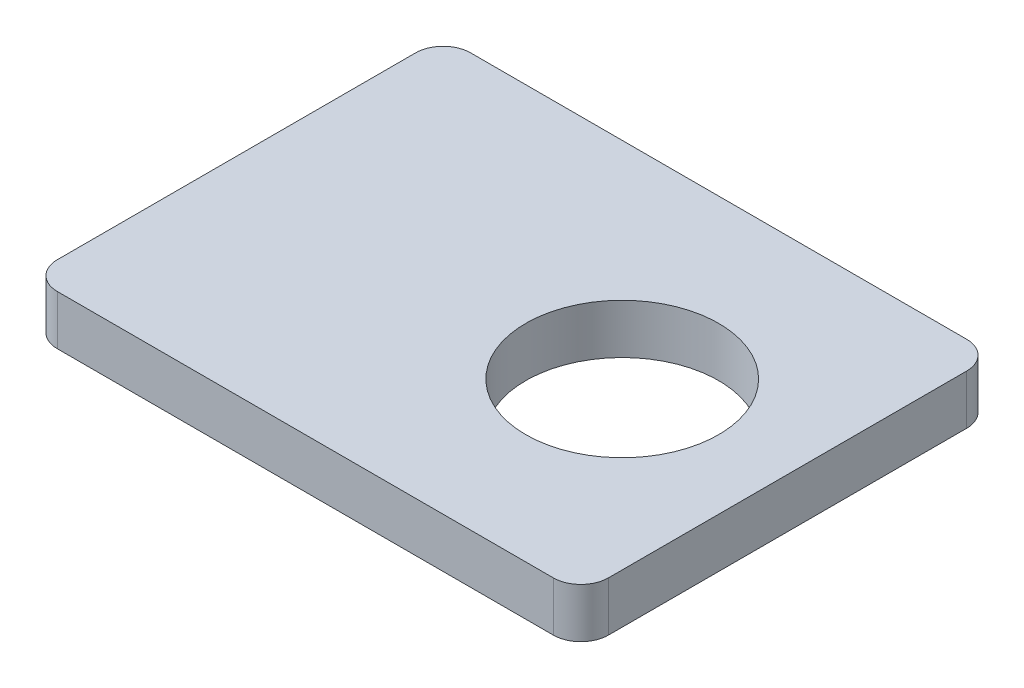
ISO-10303-21;
HEADER;
FILE_DESCRIPTION(('STEP AP214'),'2;1');
FILE_NAME('part.step','',(''),(''),'','','');
FILE_SCHEMA(('AUTOMOTIVE_DESIGN { 1 0 10303 214 1 1 1 1 }'));
ENDSEC;
DATA;
#1=APPLICATION_CONTEXT('core data for automotive mechanical design processes');
#2=APPLICATION_PROTOCOL_DEFINITION('international standard','automotive_design',2000,#1);
#3=PRODUCT_CONTEXT('',#1,'mechanical');
#4=PRODUCT('Part','Part','',(#3));
#5=PRODUCT_RELATED_PRODUCT_CATEGORY('part','',(#4));
#6=PRODUCT_DEFINITION_FORMATION('','',#4);
#7=PRODUCT_DEFINITION_CONTEXT('part definition',#1,'design');
#8=PRODUCT_DEFINITION('design','',#6,#7);
#9=PRODUCT_DEFINITION_SHAPE('','',#8);
#10=(LENGTH_UNIT() NAMED_UNIT(*) SI_UNIT(.MILLI.,.METRE.));
#11=(NAMED_UNIT(*) PLANE_ANGLE_UNIT() SI_UNIT($,.RADIAN.));
#12=(NAMED_UNIT(*) SI_UNIT($,.STERADIAN.) SOLID_ANGLE_UNIT());
#13=UNCERTAINTY_MEASURE_WITH_UNIT(LENGTH_MEASURE(1.E-05),#10,'distance_accuracy_value','');
#14=(GEOMETRIC_REPRESENTATION_CONTEXT(3) GLOBAL_UNCERTAINTY_ASSIGNED_CONTEXT((#13)) GLOBAL_UNIT_ASSIGNED_CONTEXT((#10,
#11,#12)) REPRESENTATION_CONTEXT('',''));
#15=CARTESIAN_POINT('',(0.,0.,0.));
#16=DIRECTION('',(0.,0.,1.));
#17=DIRECTION('',(1.,0.,0.));
#18=AXIS2_PLACEMENT_3D('',#15,#16,#17);
#19=CARTESIAN_POINT('',(0.,18.,0.));
#20=DIRECTION('',(0.,-1.,0.));
#21=DIRECTION('',(0.,0.,-1.));
#22=AXIS2_PLACEMENT_3D('',#19,#20,#21);
#23=PLANE('',#22);
#24=DIRECTION('',(-1.,0.,0.));
#25=VECTOR('',#24,1.);
#26=CARTESIAN_POINT('',(-100.,18.,-75.));
#27=LINE('',#26,#25);
#28=CARTESIAN_POINT('',(90.,18.,-75.));
#29=VERTEX_POINT('',#28);
#30=CARTESIAN_POINT('',(-90.,18.,-75.));
#31=VERTEX_POINT('',#30);
#32=EDGE_CURVE('E139',#29,#31,#27,.T.);
#33=ORIENTED_EDGE('',*,*,#32,.T.);
#34=CARTESIAN_POINT('',(-90.,18.,-65.));
#35=DIRECTION('',(0.,-1.,0.));
#36=DIRECTION('',(0.,0.,-1.));
#37=AXIS2_PLACEMENT_3D('',#34,#35,#36);
#38=CIRCLE('',#37,10.);
#39=CARTESIAN_POINT('',(-100.,18.,-65.));
#40=VERTEX_POINT('',#39);
#41=EDGE_CURVE('E158',#31,#40,#38,.F.);
#42=ORIENTED_EDGE('',*,*,#41,.T.);
#43=DIRECTION('',(0.,0.,1.));
#44=VECTOR('',#43,1.);
#45=CARTESIAN_POINT('',(-100.,18.,75.));
#46=LINE('',#45,#44);
#47=CARTESIAN_POINT('',(-100.,18.,65.));
#48=VERTEX_POINT('',#47);
#49=EDGE_CURVE('E122',#40,#48,#46,.T.);
#50=ORIENTED_EDGE('',*,*,#49,.T.);
#51=CARTESIAN_POINT('',(-90.,18.,65.));
#52=DIRECTION('',(0.,-1.,0.));
#53=DIRECTION('',(0.,0.,-1.));
#54=AXIS2_PLACEMENT_3D('',#51,#52,#53);
#55=CIRCLE('',#54,10.);
#56=CARTESIAN_POINT('',(-90.,18.,75.));
#57=VERTEX_POINT('',#56);
#58=EDGE_CURVE('E156',#48,#57,#55,.F.);
#59=ORIENTED_EDGE('',*,*,#58,.T.);
#60=DIRECTION('',(1.,0.,0.));
#61=VECTOR('',#60,1.);
#62=CARTESIAN_POINT('',(-100.,18.,75.));
#63=LINE('',#62,#61);
#64=CARTESIAN_POINT('',(90.,18.,75.));
#65=VERTEX_POINT('',#64);
#66=EDGE_CURVE('E178',#57,#65,#63,.T.);
#67=ORIENTED_EDGE('',*,*,#66,.T.);
#68=CARTESIAN_POINT('',(90.,18.,65.));
#69=DIRECTION('',(0.,-1.,0.));
#70=DIRECTION('',(0.,0.,-1.));
#71=AXIS2_PLACEMENT_3D('',#68,#69,#70);
#72=CIRCLE('',#71,10.);
#73=CARTESIAN_POINT('',(100.,18.,65.));
#74=VERTEX_POINT('',#73);
#75=EDGE_CURVE('E57',#65,#74,#72,.F.);
#76=ORIENTED_EDGE('',*,*,#75,.T.);
#77=DIRECTION('',(0.,0.,-1.));
#78=VECTOR('',#77,1.);
#79=CARTESIAN_POINT('',(100.,18.,75.));
#80=LINE('',#79,#78);
#81=CARTESIAN_POINT('',(100.,18.,-65.));
#82=VERTEX_POINT('',#81);
#83=EDGE_CURVE('E168',#74,#82,#80,.T.);
#84=ORIENTED_EDGE('',*,*,#83,.T.);
#85=CARTESIAN_POINT('',(90.,18.,-65.));
#86=DIRECTION('',(0.,-1.,0.));
#87=DIRECTION('',(0.,0.,-1.));
#88=AXIS2_PLACEMENT_3D('',#85,#86,#87);
#89=CIRCLE('',#88,10.);
#90=EDGE_CURVE('E154',#82,#29,#89,.F.);
#91=ORIENTED_EDGE('',*,*,#90,.T.);
#92=EDGE_LOOP('',(#33,#42,#50,#59,#67,#76,#84,#91));
#93=FACE_BOUND('',#92,.T.);
#94=CARTESIAN_POINT('',(40.,18.,0.));
#95=DIRECTION('',(0.,1.,0.));
#96=DIRECTION('',(0.,0.,1.));
#97=AXIS2_PLACEMENT_3D('',#94,#95,#96);
#98=CIRCLE('',#97,35.);
#99=CARTESIAN_POINT('',(40.,18.,35.));
#100=VERTEX_POINT('',#99);
#101=EDGE_CURVE('E130',#100,#100,#98,.T.);
#102=ORIENTED_EDGE('',*,*,#101,.F.);
#103=EDGE_LOOP('',(#102));
#104=FACE_BOUND('',#103,.T.);
#105=ADVANCED_FACE('F37',(#93,#104),#23,.F.);
#106=CARTESIAN_POINT('',(0.,0.,0.));
#107=DIRECTION('',(0.,-1.,0.));
#108=DIRECTION('',(0.,0.,-1.));
#109=AXIS2_PLACEMENT_3D('',#106,#107,#108);
#110=PLANE('',#109);
#111=DIRECTION('',(0.,0.,1.));
#112=VECTOR('',#111,1.);
#113=CARTESIAN_POINT('',(-100.,0.,75.));
#114=LINE('',#113,#112);
#115=CARTESIAN_POINT('',(-100.,0.,-65.));
#116=VERTEX_POINT('',#115);
#117=CARTESIAN_POINT('',(-100.,0.,65.));
#118=VERTEX_POINT('',#117);
#119=EDGE_CURVE('E119',#116,#118,#114,.T.);
#120=ORIENTED_EDGE('',*,*,#119,.F.);
#121=CARTESIAN_POINT('',(-90.,0.,-65.));
#122=DIRECTION('',(0.,-1.,0.));
#123=DIRECTION('',(0.,0.,-1.));
#124=AXIS2_PLACEMENT_3D('',#121,#122,#123);
#125=CIRCLE('',#124,10.);
#126=CARTESIAN_POINT('',(-90.,0.,-75.));
#127=VERTEX_POINT('',#126);
#128=EDGE_CURVE('E102',#116,#127,#125,.T.);
#129=ORIENTED_EDGE('',*,*,#128,.T.);
#130=DIRECTION('',(-1.,0.,0.));
#131=VECTOR('',#130,1.);
#132=CARTESIAN_POINT('',(-100.,0.,-75.));
#133=LINE('',#132,#131);
#134=CARTESIAN_POINT('',(90.,0.,-75.));
#135=VERTEX_POINT('',#134);
#136=EDGE_CURVE('E143',#135,#127,#133,.T.);
#137=ORIENTED_EDGE('',*,*,#136,.F.);
#138=CARTESIAN_POINT('',(90.,0.,-65.));
#139=DIRECTION('',(0.,-1.,0.));
#140=DIRECTION('',(0.,0.,-1.));
#141=AXIS2_PLACEMENT_3D('',#138,#139,#140);
#142=CIRCLE('',#141,10.);
#143=CARTESIAN_POINT('',(100.,0.,-65.));
#144=VERTEX_POINT('',#143);
#145=EDGE_CURVE('E147',#135,#144,#142,.T.);
#146=ORIENTED_EDGE('',*,*,#145,.T.);
#147=DIRECTION('',(0.,0.,-1.));
#148=VECTOR('',#147,1.);
#149=CARTESIAN_POINT('',(100.,0.,75.));
#150=LINE('',#149,#148);
#151=CARTESIAN_POINT('',(100.,0.,65.));
#152=VERTEX_POINT('',#151);
#153=EDGE_CURVE('E133',#152,#144,#150,.T.);
#154=ORIENTED_EDGE('',*,*,#153,.F.);
#155=CARTESIAN_POINT('',(90.,0.,65.));
#156=DIRECTION('',(0.,-1.,0.));
#157=DIRECTION('',(0.,0.,-1.));
#158=AXIS2_PLACEMENT_3D('',#155,#156,#157);
#159=CIRCLE('',#158,10.);
#160=CARTESIAN_POINT('',(90.,0.,75.));
#161=VERTEX_POINT('',#160);
#162=EDGE_CURVE('E123',#152,#161,#159,.T.);
#163=ORIENTED_EDGE('',*,*,#162,.T.);
#164=DIRECTION('',(1.,0.,0.));
#165=VECTOR('',#164,1.);
#166=CARTESIAN_POINT('',(-100.,0.,75.));
#167=LINE('',#166,#165);
#168=CARTESIAN_POINT('',(-90.,0.,75.));
#169=VERTEX_POINT('',#168);
#170=EDGE_CURVE('E129',#169,#161,#167,.T.);
#171=ORIENTED_EDGE('',*,*,#170,.F.);
#172=CARTESIAN_POINT('',(-90.,0.,65.));
#173=DIRECTION('',(0.,-1.,0.));
#174=DIRECTION('',(0.,0.,-1.));
#175=AXIS2_PLACEMENT_3D('',#172,#173,#174);
#176=CIRCLE('',#175,10.);
#177=EDGE_CURVE('E113',#169,#118,#176,.T.);
#178=ORIENTED_EDGE('',*,*,#177,.T.);
#179=EDGE_LOOP('',(#120,#129,#137,#146,#154,#163,#171,#178));
#180=FACE_BOUND('',#179,.T.);
#181=CARTESIAN_POINT('',(40.,0.,0.));
#182=DIRECTION('',(0.,1.,0.));
#183=DIRECTION('',(0.,0.,1.));
#184=AXIS2_PLACEMENT_3D('',#181,#182,#183);
#185=CIRCLE('',#184,35.);
#186=CARTESIAN_POINT('',(40.,0.,35.));
#187=VERTEX_POINT('',#186);
#188=EDGE_CURVE('E136',#187,#187,#185,.T.);
#189=ORIENTED_EDGE('',*,*,#188,.T.);
#190=EDGE_LOOP('',(#189));
#191=FACE_BOUND('',#190,.T.);
#192=ADVANCED_FACE('F126',(#180,#191),#110,.T.);
#193=CARTESIAN_POINT('',(-100.,18.,75.));
#194=DIRECTION('',(1.,0.,0.));
#195=DIRECTION('',(0.,0.,-1.));
#196=AXIS2_PLACEMENT_3D('',#193,#194,#195);
#197=PLANE('',#196);
#198=ORIENTED_EDGE('',*,*,#49,.F.);
#199=DIRECTION('',(0.,-1.,0.));
#200=VECTOR('',#199,1.);
#201=CARTESIAN_POINT('',(-100.,18.,-65.));
#202=LINE('',#201,#200);
#203=EDGE_CURVE('E106',#40,#116,#202,.T.);
#204=ORIENTED_EDGE('',*,*,#203,.T.);
#205=ORIENTED_EDGE('',*,*,#119,.T.);
#206=DIRECTION('',(0.,-1.,0.));
#207=VECTOR('',#206,1.);
#208=CARTESIAN_POINT('',(-100.,18.,65.));
#209=LINE('',#208,#207);
#210=EDGE_CURVE('E124',#118,#48,#209,.F.);
#211=ORIENTED_EDGE('',*,*,#210,.T.);
#212=EDGE_LOOP('',(#198,#204,#205,#211));
#213=FACE_BOUND('',#212,.T.);
#214=ADVANCED_FACE('F118',(#213),#197,.F.);
#215=CARTESIAN_POINT('',(-100.,18.,75.));
#216=DIRECTION('',(0.,0.,-1.));
#217=DIRECTION('',(-1.,0.,0.));
#218=AXIS2_PLACEMENT_3D('',#215,#216,#217);
#219=PLANE('',#218);
#220=ORIENTED_EDGE('',*,*,#66,.F.);
#221=DIRECTION('',(0.,-1.,0.));
#222=VECTOR('',#221,1.);
#223=CARTESIAN_POINT('',(-90.,18.,75.));
#224=LINE('',#223,#222);
#225=EDGE_CURVE('E162',#57,#169,#224,.T.);
#226=ORIENTED_EDGE('',*,*,#225,.T.);
#227=ORIENTED_EDGE('',*,*,#170,.T.);
#228=DIRECTION('',(0.,-1.,0.));
#229=VECTOR('',#228,1.);
#230=CARTESIAN_POINT('',(90.,18.,75.));
#231=LINE('',#230,#229);
#232=EDGE_CURVE('E160',#161,#65,#231,.F.);
#233=ORIENTED_EDGE('',*,*,#232,.T.);
#234=EDGE_LOOP('',(#220,#226,#227,#233));
#235=FACE_BOUND('',#234,.T.);
#236=ADVANCED_FACE('F206',(#235),#219,.F.);
#237=CARTESIAN_POINT('',(100.,18.,75.));
#238=DIRECTION('',(-1.,0.,0.));
#239=DIRECTION('',(0.,0.,1.));
#240=AXIS2_PLACEMENT_3D('',#237,#238,#239);
#241=PLANE('',#240);
#242=ORIENTED_EDGE('',*,*,#153,.T.);
#243=DIRECTION('',(0.,-1.,0.));
#244=VECTOR('',#243,1.);
#245=CARTESIAN_POINT('',(100.,18.,-65.));
#246=LINE('',#245,#244);
#247=EDGE_CURVE('E11',#144,#82,#246,.F.);
#248=ORIENTED_EDGE('',*,*,#247,.T.);
#249=ORIENTED_EDGE('',*,*,#83,.F.);
#250=DIRECTION('',(0.,-1.,0.));
#251=VECTOR('',#250,1.);
#252=CARTESIAN_POINT('',(100.,18.,65.));
#253=LINE('',#252,#251);
#254=EDGE_CURVE('E45',#74,#152,#253,.T.);
#255=ORIENTED_EDGE('',*,*,#254,.T.);
#256=EDGE_LOOP('',(#242,#248,#249,#255));
#257=FACE_BOUND('',#256,.T.);
#258=ADVANCED_FACE('F167',(#257),#241,.F.);
#259=CARTESIAN_POINT('',(-100.,18.,-75.));
#260=DIRECTION('',(0.,0.,1.));
#261=DIRECTION('',(1.,0.,0.));
#262=AXIS2_PLACEMENT_3D('',#259,#260,#261);
#263=PLANE('',#262);
#264=ORIENTED_EDGE('',*,*,#136,.T.);
#265=DIRECTION('',(0.,-1.,0.));
#266=VECTOR('',#265,1.);
#267=CARTESIAN_POINT('',(-90.,18.,-75.));
#268=LINE('',#267,#266);
#269=EDGE_CURVE('E107',#127,#31,#268,.F.);
#270=ORIENTED_EDGE('',*,*,#269,.T.);
#271=ORIENTED_EDGE('',*,*,#32,.F.);
#272=DIRECTION('',(0.,-1.,0.));
#273=VECTOR('',#272,1.);
#274=CARTESIAN_POINT('',(90.,18.,-75.));
#275=LINE('',#274,#273);
#276=EDGE_CURVE('E112',#29,#135,#275,.T.);
#277=ORIENTED_EDGE('',*,*,#276,.T.);
#278=EDGE_LOOP('',(#264,#270,#271,#277));
#279=FACE_BOUND('',#278,.T.);
#280=ADVANCED_FACE('F176',(#279),#263,.F.);
#281=CARTESIAN_POINT('',(40.,18.,0.));
#282=DIRECTION('',(0.,-1.,0.));
#283=DIRECTION('',(0.,0.,-1.));
#284=AXIS2_PLACEMENT_3D('',#281,#282,#283);
#285=CYLINDRICAL_SURFACE('',#284,35.);
#286=ORIENTED_EDGE('',*,*,#101,.T.);
#287=EDGE_LOOP('',(#286));
#288=FACE_BOUND('',#287,.T.);
#289=ORIENTED_EDGE('',*,*,#188,.F.);
#290=EDGE_LOOP('',(#289));
#291=FACE_BOUND('',#290,.T.);
#292=ADVANCED_FACE('F185',(#288,#291),#285,.F.);
#293=CARTESIAN_POINT('',(-90.,18.,-65.));
#294=DIRECTION('',(0.,-1.,0.));
#295=DIRECTION('',(0.,0.,-1.));
#296=AXIS2_PLACEMENT_3D('',#293,#294,#295);
#297=CYLINDRICAL_SURFACE('',#296,10.);
#298=ORIENTED_EDGE('',*,*,#41,.F.);
#299=ORIENTED_EDGE('',*,*,#269,.F.);
#300=ORIENTED_EDGE('',*,*,#128,.F.);
#301=ORIENTED_EDGE('',*,*,#203,.F.);
#302=EDGE_LOOP('',(#298,#299,#300,#301));
#303=FACE_BOUND('',#302,.T.);
#304=ADVANCED_FACE('F105',(#303),#297,.T.);
#305=CARTESIAN_POINT('',(-90.,18.,65.));
#306=DIRECTION('',(0.,-1.,0.));
#307=DIRECTION('',(0.,0.,-1.));
#308=AXIS2_PLACEMENT_3D('',#305,#306,#307);
#309=CYLINDRICAL_SURFACE('',#308,10.);
#310=ORIENTED_EDGE('',*,*,#58,.F.);
#311=ORIENTED_EDGE('',*,*,#210,.F.);
#312=ORIENTED_EDGE('',*,*,#177,.F.);
#313=ORIENTED_EDGE('',*,*,#225,.F.);
#314=EDGE_LOOP('',(#310,#311,#312,#313));
#315=FACE_BOUND('',#314,.T.);
#316=ADVANCED_FACE('F193',(#315),#309,.T.);
#317=CARTESIAN_POINT('',(90.,18.,-65.));
#318=DIRECTION('',(0.,-1.,0.));
#319=DIRECTION('',(0.,0.,-1.));
#320=AXIS2_PLACEMENT_3D('',#317,#318,#319);
#321=CYLINDRICAL_SURFACE('',#320,10.);
#322=ORIENTED_EDGE('',*,*,#90,.F.);
#323=ORIENTED_EDGE('',*,*,#247,.F.);
#324=ORIENTED_EDGE('',*,*,#145,.F.);
#325=ORIENTED_EDGE('',*,*,#276,.F.);
#326=EDGE_LOOP('',(#322,#323,#324,#325));
#327=FACE_BOUND('',#326,.T.);
#328=ADVANCED_FACE('F173',(#327),#321,.T.);
#329=CARTESIAN_POINT('',(90.,18.,65.));
#330=DIRECTION('',(0.,-1.,0.));
#331=DIRECTION('',(0.,0.,-1.));
#332=AXIS2_PLACEMENT_3D('',#329,#330,#331);
#333=CYLINDRICAL_SURFACE('',#332,10.);
#334=ORIENTED_EDGE('',*,*,#75,.F.);
#335=ORIENTED_EDGE('',*,*,#232,.F.);
#336=ORIENTED_EDGE('',*,*,#162,.F.);
#337=ORIENTED_EDGE('',*,*,#254,.F.);
#338=EDGE_LOOP('',(#334,#335,#336,#337));
#339=FACE_BOUND('',#338,.T.);
#340=ADVANCED_FACE('F39',(#339),#333,.T.);
#341=CLOSED_SHELL('',(#105,#192,#214,#236,#258,#280,#292,#304,#316,#328,#340));
#342=MANIFOLD_SOLID_BREP('B2',#341);
#343=ADVANCED_BREP_SHAPE_REPRESENTATION('',(#18,#342),#14);
#344=SHAPE_DEFINITION_REPRESENTATION(#9,#343);
ENDSEC;
END-ISO-10303-21;
